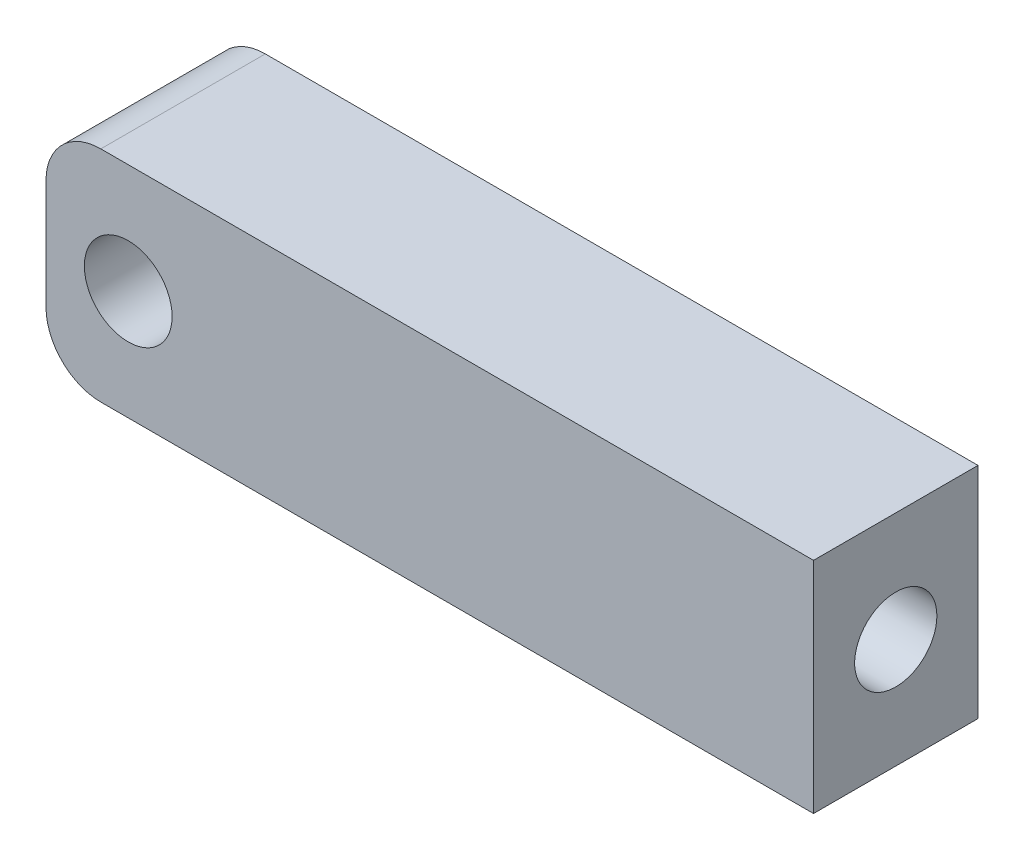
ISO-10303-21;
HEADER;
FILE_DESCRIPTION(('STEP AP214'),'2;1');
FILE_NAME('part.step','',(''),(''),'','','');
FILE_SCHEMA(('AUTOMOTIVE_DESIGN { 1 0 10303 214 1 1 1 1 }'));
ENDSEC;
DATA;
#1=APPLICATION_CONTEXT('core data for automotive mechanical design processes');
#2=APPLICATION_PROTOCOL_DEFINITION('international standard','automotive_design',2000,#1);
#3=PRODUCT_CONTEXT('',#1,'mechanical');
#4=PRODUCT('Part','Part','',(#3));
#5=PRODUCT_RELATED_PRODUCT_CATEGORY('part','',(#4));
#6=PRODUCT_DEFINITION_FORMATION('','',#4);
#7=PRODUCT_DEFINITION_CONTEXT('part definition',#1,'design');
#8=PRODUCT_DEFINITION('design','',#6,#7);
#9=PRODUCT_DEFINITION_SHAPE('','',#8);
#10=(LENGTH_UNIT() NAMED_UNIT(*) SI_UNIT(.MILLI.,.METRE.));
#11=(NAMED_UNIT(*) PLANE_ANGLE_UNIT() SI_UNIT($,.RADIAN.));
#12=(NAMED_UNIT(*) SI_UNIT($,.STERADIAN.) SOLID_ANGLE_UNIT());
#13=UNCERTAINTY_MEASURE_WITH_UNIT(LENGTH_MEASURE(1.E-05),#10,'distance_accuracy_value','');
#14=(GEOMETRIC_REPRESENTATION_CONTEXT(3) GLOBAL_UNCERTAINTY_ASSIGNED_CONTEXT((#13)) GLOBAL_UNIT_ASSIGNED_CONTEXT((#10,
#11,#12)) REPRESENTATION_CONTEXT('',''));
#15=CARTESIAN_POINT('',(0.,0.,0.));
#16=DIRECTION('',(0.,0.,1.));
#17=DIRECTION('',(1.,0.,0.));
#18=AXIS2_PLACEMENT_3D('',#15,#16,#17);
#19=CARTESIAN_POINT('',(3.,4.,6.));
#20=DIRECTION('',(0.,0.,-1.));
#21=DIRECTION('',(-1.,0.,0.));
#22=AXIS2_PLACEMENT_3D('',#19,#20,#21);
#23=CYLINDRICAL_SURFACE('',#22,1.6);
#24=CARTESIAN_POINT('',(3.,4.,6.));
#25=DIRECTION('',(0.,0.,1.));
#26=DIRECTION('',(1.,0.,0.));
#27=AXIS2_PLACEMENT_3D('',#24,#25,#26);
#28=CIRCLE('',#27,1.6);
#29=CARTESIAN_POINT('',(4.6,4.,6.));
#30=VERTEX_POINT('',#29);
#31=EDGE_CURVE('E137',#30,#30,#28,.T.);
#32=ORIENTED_EDGE('',*,*,#31,.T.);
#33=EDGE_LOOP('',(#32));
#34=FACE_BOUND('',#33,.T.);
#35=CARTESIAN_POINT('',(3.,4.,3.));
#36=DIRECTION('',(0.,0.,-1.));
#37=DIRECTION('',(-1.,0.,0.));
#38=AXIS2_PLACEMENT_3D('',#35,#36,#37);
#39=CIRCLE('',#38,1.6);
#40=CARTESIAN_POINT('',(1.4,4.,3.));
#41=VERTEX_POINT('',#40);
#42=EDGE_CURVE('E156',#41,#41,#39,.T.);
#43=ORIENTED_EDGE('',*,*,#42,.T.);
#44=EDGE_LOOP('',(#43));
#45=FACE_BOUND('',#44,.T.);
#46=ADVANCED_FACE('F36',(#34,#45),#23,.F.);
#47=CARTESIAN_POINT('',(2.,2.,6.));
#48=DIRECTION('',(0.,0.,1.));
#49=DIRECTION('',(1.,0.,0.));
#50=AXIS2_PLACEMENT_3D('',#47,#48,#49);
#51=PLANE('',#50);
#52=CARTESIAN_POINT('',(2.,2.,6.));
#53=DIRECTION('',(0.,0.,1.));
#54=DIRECTION('',(1.,0.,0.));
#55=AXIS2_PLACEMENT_3D('',#52,#53,#54);
#56=CIRCLE('',#55,2.);
#57=CARTESIAN_POINT('',(0.,2.00000000000001,6.));
#58=VERTEX_POINT('',#57);
#59=CARTESIAN_POINT('',(2.00000000000001,0.,6.));
#60=VERTEX_POINT('',#59);
#61=EDGE_CURVE('E147',#58,#60,#56,.T.);
#62=ORIENTED_EDGE('',*,*,#61,.T.);
#63=DIRECTION('',(1.,0.,0.));
#64=VECTOR('',#63,1.);
#65=CARTESIAN_POINT('',(28.,0.,6.));
#66=LINE('',#65,#64);
#67=CARTESIAN_POINT('',(28.,0.,6.));
#68=VERTEX_POINT('',#67);
#69=EDGE_CURVE('E94',#60,#68,#66,.T.);
#70=ORIENTED_EDGE('',*,*,#69,.T.);
#71=DIRECTION('',(0.,1.,0.));
#72=VECTOR('',#71,1.);
#73=CARTESIAN_POINT('',(28.,8.,6.));
#74=LINE('',#73,#72);
#75=CARTESIAN_POINT('',(28.,8.,6.));
#76=VERTEX_POINT('',#75);
#77=EDGE_CURVE('E111',#68,#76,#74,.T.);
#78=ORIENTED_EDGE('',*,*,#77,.T.);
#79=DIRECTION('',(-1.,0.,0.));
#80=VECTOR('',#79,1.);
#81=CARTESIAN_POINT('',(2.,8.,6.));
#82=LINE('',#81,#80);
#83=CARTESIAN_POINT('',(2.,8.,6.));
#84=VERTEX_POINT('',#83);
#85=EDGE_CURVE('E103',#76,#84,#82,.T.);
#86=ORIENTED_EDGE('',*,*,#85,.T.);
#87=CARTESIAN_POINT('',(2.,6.,6.));
#88=DIRECTION('',(0.,0.,1.));
#89=DIRECTION('',(-1.,0.,0.));
#90=AXIS2_PLACEMENT_3D('',#87,#88,#89);
#91=CIRCLE('',#90,2.);
#92=CARTESIAN_POINT('',(0.,6.,6.));
#93=VERTEX_POINT('',#92);
#94=EDGE_CURVE('E108',#84,#93,#91,.T.);
#95=ORIENTED_EDGE('',*,*,#94,.T.);
#96=DIRECTION('',(0.,-1.,0.));
#97=VECTOR('',#96,1.);
#98=CARTESIAN_POINT('',(0.,2.00000000000001,6.));
#99=LINE('',#98,#97);
#100=EDGE_CURVE('E59',#93,#58,#99,.T.);
#101=ORIENTED_EDGE('',*,*,#100,.T.);
#102=EDGE_LOOP('',(#62,#70,#78,#86,#95,#101));
#103=FACE_BOUND('',#102,.T.);
#104=ORIENTED_EDGE('',*,*,#31,.F.);
#105=EDGE_LOOP('',(#104));
#106=FACE_BOUND('',#105,.T.);
#107=ADVANCED_FACE('F105',(#103,#106),#51,.T.);
#108=CARTESIAN_POINT('',(2.,2.,0.));
#109=DIRECTION('',(0.,0.,1.));
#110=DIRECTION('',(1.,0.,0.));
#111=AXIS2_PLACEMENT_3D('',#108,#109,#110);
#112=PLANE('',#111);
#113=DIRECTION('',(0.,-1.,0.));
#114=VECTOR('',#113,1.);
#115=CARTESIAN_POINT('',(0.,2.00000000000001,0.));
#116=LINE('',#115,#114);
#117=CARTESIAN_POINT('',(0.,2.01002512578676,0.));
#118=VERTEX_POINT('',#117);
#119=CARTESIAN_POINT('',(0.,2.00000000000001,0.));
#120=VERTEX_POINT('',#119);
#121=EDGE_CURVE('E85',#118,#120,#116,.T.);
#122=ORIENTED_EDGE('',*,*,#121,.F.);
#123=CARTESIAN_POINT('',(3.,4.,0.));
#124=DIRECTION('',(0.,0.,-1.));
#125=DIRECTION('',(-1.,0.,0.));
#126=AXIS2_PLACEMENT_3D('',#123,#124,#125);
#127=CIRCLE('',#126,3.6);
#128=CARTESIAN_POINT('',(0.,5.98997487421324,0.));
#129=VERTEX_POINT('',#128);
#130=EDGE_CURVE('E170',#129,#118,#127,.T.);
#131=ORIENTED_EDGE('',*,*,#130,.F.);
#132=CARTESIAN_POINT('',(0.,6.,0.));
#133=VERTEX_POINT('',#132);
#134=EDGE_CURVE('E144',#133,#129,#116,.T.);
#135=ORIENTED_EDGE('',*,*,#134,.F.);
#136=CARTESIAN_POINT('',(2.,6.,0.));
#137=DIRECTION('',(0.,0.,1.));
#138=DIRECTION('',(-1.,0.,0.));
#139=AXIS2_PLACEMENT_3D('',#136,#137,#138);
#140=CIRCLE('',#139,2.);
#141=CARTESIAN_POINT('',(2.,8.,0.));
#142=VERTEX_POINT('',#141);
#143=EDGE_CURVE('E142',#142,#133,#140,.T.);
#144=ORIENTED_EDGE('',*,*,#143,.F.);
#145=DIRECTION('',(-1.,0.,0.));
#146=VECTOR('',#145,1.);
#147=CARTESIAN_POINT('',(2.,8.,0.));
#148=LINE('',#147,#146);
#149=CARTESIAN_POINT('',(28.,8.,0.));
#150=VERTEX_POINT('',#149);
#151=EDGE_CURVE('E120',#150,#142,#148,.T.);
#152=ORIENTED_EDGE('',*,*,#151,.F.);
#153=DIRECTION('',(0.,1.,0.));
#154=VECTOR('',#153,1.);
#155=CARTESIAN_POINT('',(28.,8.,0.));
#156=LINE('',#155,#154);
#157=CARTESIAN_POINT('',(28.,0.,0.));
#158=VERTEX_POINT('',#157);
#159=EDGE_CURVE('E139',#158,#150,#156,.T.);
#160=ORIENTED_EDGE('',*,*,#159,.F.);
#161=DIRECTION('',(1.,0.,0.));
#162=VECTOR('',#161,1.);
#163=CARTESIAN_POINT('',(28.,0.,0.));
#164=LINE('',#163,#162);
#165=CARTESIAN_POINT('',(2.00000000000001,0.,0.));
#166=VERTEX_POINT('',#165);
#167=EDGE_CURVE('E136',#166,#158,#164,.T.);
#168=ORIENTED_EDGE('',*,*,#167,.F.);
#169=CARTESIAN_POINT('',(2.,2.,0.));
#170=DIRECTION('',(0.,0.,1.));
#171=DIRECTION('',(1.,0.,0.));
#172=AXIS2_PLACEMENT_3D('',#169,#170,#171);
#173=CIRCLE('',#172,2.);
#174=EDGE_CURVE('E133',#120,#166,#173,.T.);
#175=ORIENTED_EDGE('',*,*,#174,.F.);
#176=EDGE_LOOP('',(#122,#131,#135,#144,#152,#160,#168,#175));
#177=FACE_BOUND('',#176,.T.);
#178=ADVANCED_FACE('F173',(#177),#112,.F.);
#179=CARTESIAN_POINT('',(2.,2.,6.));
#180=DIRECTION('',(0.,0.,-1.));
#181=DIRECTION('',(-1.,0.,0.));
#182=AXIS2_PLACEMENT_3D('',#179,#180,#181);
#183=CYLINDRICAL_SURFACE('',#182,2.);
#184=ORIENTED_EDGE('',*,*,#174,.T.);
#185=DIRECTION('',(0.,0.,-1.));
#186=VECTOR('',#185,1.);
#187=CARTESIAN_POINT('',(2.00000000000001,0.,6.));
#188=LINE('',#187,#186);
#189=EDGE_CURVE('E154',#60,#166,#188,.T.);
#190=ORIENTED_EDGE('',*,*,#189,.F.);
#191=ORIENTED_EDGE('',*,*,#61,.F.);
#192=DIRECTION('',(0.,0.,-1.));
#193=VECTOR('',#192,1.);
#194=CARTESIAN_POINT('',(0.,2.00000000000001,6.));
#195=LINE('',#194,#193);
#196=EDGE_CURVE('E129',#58,#120,#195,.T.);
#197=ORIENTED_EDGE('',*,*,#196,.T.);
#198=EDGE_LOOP('',(#184,#190,#191,#197));
#199=FACE_BOUND('',#198,.T.);
#200=ADVANCED_FACE('F38',(#199),#183,.T.);
#201=CARTESIAN_POINT('',(28.,0.,6.));
#202=DIRECTION('',(0.,1.,0.));
#203=DIRECTION('',(-1.,0.,0.));
#204=AXIS2_PLACEMENT_3D('',#201,#202,#203);
#205=PLANE('',#204);
#206=ORIENTED_EDGE('',*,*,#167,.T.);
#207=DIRECTION('',(0.,0.,-1.));
#208=VECTOR('',#207,1.);
#209=CARTESIAN_POINT('',(28.,0.,6.));
#210=LINE('',#209,#208);
#211=EDGE_CURVE('E151',#68,#158,#210,.T.);
#212=ORIENTED_EDGE('',*,*,#211,.F.);
#213=ORIENTED_EDGE('',*,*,#69,.F.);
#214=ORIENTED_EDGE('',*,*,#189,.T.);
#215=EDGE_LOOP('',(#206,#212,#213,#214));
#216=FACE_BOUND('',#215,.T.);
#217=ADVANCED_FACE('F190',(#216),#205,.F.);
#218=CARTESIAN_POINT('',(28.,8.,6.));
#219=DIRECTION('',(-1.,0.,0.));
#220=DIRECTION('',(0.,0.,1.));
#221=AXIS2_PLACEMENT_3D('',#218,#219,#220);
#222=PLANE('',#221);
#223=CARTESIAN_POINT('',(28.,4.,3.));
#224=DIRECTION('',(1.,0.,0.));
#225=DIRECTION('',(0.,0.,-1.));
#226=AXIS2_PLACEMENT_3D('',#223,#224,#225);
#227=CIRCLE('',#226,1.5);
#228=CARTESIAN_POINT('',(28.,4.,1.5));
#229=VERTEX_POINT('',#228);
#230=EDGE_CURVE('E179',#229,#229,#227,.T.);
#231=ORIENTED_EDGE('',*,*,#230,.F.);
#232=EDGE_LOOP('',(#231));
#233=FACE_BOUND('',#232,.T.);
#234=ORIENTED_EDGE('',*,*,#159,.T.);
#235=DIRECTION('',(0.,0.,-1.));
#236=VECTOR('',#235,1.);
#237=CARTESIAN_POINT('',(28.,8.,6.));
#238=LINE('',#237,#236);
#239=EDGE_CURVE('E123',#76,#150,#238,.T.);
#240=ORIENTED_EDGE('',*,*,#239,.F.);
#241=ORIENTED_EDGE('',*,*,#77,.F.);
#242=ORIENTED_EDGE('',*,*,#211,.T.);
#243=EDGE_LOOP('',(#234,#240,#241,#242));
#244=FACE_BOUND('',#243,.T.);
#245=ADVANCED_FACE('F193',(#233,#244),#222,.F.);
#246=CARTESIAN_POINT('',(2.,8.,6.));
#247=DIRECTION('',(0.,-1.,0.));
#248=DIRECTION('',(0.,0.,-1.));
#249=AXIS2_PLACEMENT_3D('',#246,#247,#248);
#250=PLANE('',#249);
#251=ORIENTED_EDGE('',*,*,#151,.T.);
#252=DIRECTION('',(0.,0.,-1.));
#253=VECTOR('',#252,1.);
#254=CARTESIAN_POINT('',(2.,8.,6.));
#255=LINE('',#254,#253);
#256=EDGE_CURVE('E117',#84,#142,#255,.T.);
#257=ORIENTED_EDGE('',*,*,#256,.F.);
#258=ORIENTED_EDGE('',*,*,#85,.F.);
#259=ORIENTED_EDGE('',*,*,#239,.T.);
#260=EDGE_LOOP('',(#251,#257,#258,#259));
#261=FACE_BOUND('',#260,.T.);
#262=ADVANCED_FACE('F118',(#261),#250,.F.);
#263=CARTESIAN_POINT('',(2.,6.,6.));
#264=DIRECTION('',(0.,0.,-1.));
#265=DIRECTION('',(-1.,0.,0.));
#266=AXIS2_PLACEMENT_3D('',#263,#264,#265);
#267=CYLINDRICAL_SURFACE('',#266,2.);
#268=ORIENTED_EDGE('',*,*,#143,.T.);
#269=DIRECTION('',(0.,0.,-1.));
#270=VECTOR('',#269,1.);
#271=CARTESIAN_POINT('',(0.,6.,6.));
#272=LINE('',#271,#270);
#273=EDGE_CURVE('E124',#93,#133,#272,.T.);
#274=ORIENTED_EDGE('',*,*,#273,.F.);
#275=ORIENTED_EDGE('',*,*,#94,.F.);
#276=ORIENTED_EDGE('',*,*,#256,.T.);
#277=EDGE_LOOP('',(#268,#274,#275,#276));
#278=FACE_BOUND('',#277,.T.);
#279=ADVANCED_FACE('F126',(#278),#267,.T.);
#280=CARTESIAN_POINT('',(0.,2.00000000000001,6.));
#281=DIRECTION('',(1.,0.,0.));
#282=DIRECTION('',(0.,0.,-1.));
#283=AXIS2_PLACEMENT_3D('',#280,#281,#282);
#284=PLANE('',#283);
#285=DIRECTION('',(0.,1.,0.));
#286=VECTOR('',#285,1.);
#287=CARTESIAN_POINT('',(0.,2.00000000000001,3.));
#288=LINE('',#287,#286);
#289=CARTESIAN_POINT('',(0.,2.01002512578676,3.));
#290=VERTEX_POINT('',#289);
#291=CARTESIAN_POINT('',(0.,5.98997487421324,3.));
#292=VERTEX_POINT('',#291);
#293=EDGE_CURVE('E158',#290,#292,#288,.T.);
#294=ORIENTED_EDGE('',*,*,#293,.F.);
#295=DIRECTION('',(0.,0.,-1.));
#296=VECTOR('',#295,1.);
#297=CARTESIAN_POINT('',(0.,2.01002512578676,3.));
#298=LINE('',#297,#296);
#299=EDGE_CURVE('E11',#290,#118,#298,.T.);
#300=ORIENTED_EDGE('',*,*,#299,.T.);
#301=ORIENTED_EDGE('',*,*,#121,.T.);
#302=ORIENTED_EDGE('',*,*,#196,.F.);
#303=ORIENTED_EDGE('',*,*,#100,.F.);
#304=ORIENTED_EDGE('',*,*,#273,.T.);
#305=ORIENTED_EDGE('',*,*,#134,.T.);
#306=DIRECTION('',(0.,0.,-1.));
#307=VECTOR('',#306,1.);
#308=CARTESIAN_POINT('',(0.,5.98997487421324,3.));
#309=LINE('',#308,#307);
#310=EDGE_CURVE('E44',#129,#292,#309,.F.);
#311=ORIENTED_EDGE('',*,*,#310,.T.);
#312=EDGE_LOOP('',(#294,#300,#301,#302,#303,#304,#305,#311));
#313=FACE_BOUND('',#312,.T.);
#314=ADVANCED_FACE('F162',(#313),#284,.F.);
#315=CARTESIAN_POINT('',(8.,4.,3.));
#316=DIRECTION('',(1.,0.,0.));
#317=DIRECTION('',(0.,0.,-1.));
#318=AXIS2_PLACEMENT_3D('',#315,#316,#317);
#319=CYLINDRICAL_SURFACE('',#318,1.5);
#320=CARTESIAN_POINT('',(8.,4.,3.));
#321=DIRECTION('',(1.,0.,0.));
#322=DIRECTION('',(0.,0.,-1.));
#323=AXIS2_PLACEMENT_3D('',#320,#321,#322);
#324=CIRCLE('',#323,1.5);
#325=CARTESIAN_POINT('',(8.,4.,1.5));
#326=VERTEX_POINT('',#325);
#327=EDGE_CURVE('E180',#326,#326,#324,.T.);
#328=ORIENTED_EDGE('',*,*,#327,.F.);
#329=EDGE_LOOP('',(#328));
#330=FACE_BOUND('',#329,.T.);
#331=ORIENTED_EDGE('',*,*,#230,.T.);
#332=EDGE_LOOP('',(#331));
#333=FACE_BOUND('',#332,.T.);
#334=ADVANCED_FACE('F212',(#330,#333),#319,.F.);
#335=CARTESIAN_POINT('',(8.,4.,3.));
#336=DIRECTION('',(1.,0.,0.));
#337=DIRECTION('',(0.,0.,-1.));
#338=AXIS2_PLACEMENT_3D('',#335,#336,#337);
#339=PLANE('',#338);
#340=ORIENTED_EDGE('',*,*,#327,.T.);
#341=EDGE_LOOP('',(#340));
#342=FACE_BOUND('',#341,.T.);
#343=ADVANCED_FACE('F228',(#342),#339,.T.);
#344=CARTESIAN_POINT('',(3.,4.,3.));
#345=DIRECTION('',(0.,0.,-1.));
#346=DIRECTION('',(-1.,0.,0.));
#347=AXIS2_PLACEMENT_3D('',#344,#345,#346);
#348=CYLINDRICAL_SURFACE('',#347,3.6);
#349=CARTESIAN_POINT('',(3.,4.,3.));
#350=DIRECTION('',(0.,0.,-1.));
#351=DIRECTION('',(-1.,0.,0.));
#352=AXIS2_PLACEMENT_3D('',#349,#350,#351);
#353=CIRCLE('',#352,3.6);
#354=EDGE_CURVE('E50',#292,#290,#353,.T.);
#355=ORIENTED_EDGE('',*,*,#354,.F.);
#356=ORIENTED_EDGE('',*,*,#310,.F.);
#357=ORIENTED_EDGE('',*,*,#130,.T.);
#358=ORIENTED_EDGE('',*,*,#299,.F.);
#359=EDGE_LOOP('',(#355,#356,#357,#358));
#360=FACE_BOUND('',#359,.T.);
#361=ADVANCED_FACE('F169',(#360),#348,.F.);
#362=CARTESIAN_POINT('',(3.,4.,3.));
#363=DIRECTION('',(0.,0.,-1.));
#364=DIRECTION('',(-1.,0.,0.));
#365=AXIS2_PLACEMENT_3D('',#362,#363,#364);
#366=PLANE('',#365);
#367=ORIENTED_EDGE('',*,*,#42,.F.);
#368=EDGE_LOOP('',(#367));
#369=FACE_BOUND('',#368,.T.);
#370=ORIENTED_EDGE('',*,*,#293,.T.);
#371=ORIENTED_EDGE('',*,*,#354,.T.);
#372=EDGE_LOOP('',(#370,#371));
#373=FACE_BOUND('',#372,.T.);
#374=ADVANCED_FACE('F239',(#369,#373),#366,.T.);
#375=CLOSED_SHELL('',(#46,#107,#178,#200,#217,#245,#262,#279,#314,#334,#343,#361,#374));
#376=MANIFOLD_SOLID_BREP('B2',#375);
#377=ADVANCED_BREP_SHAPE_REPRESENTATION('',(#18,#376),#14);
#378=SHAPE_DEFINITION_REPRESENTATION(#9,#377);
ENDSEC;
END-ISO-10303-21;
